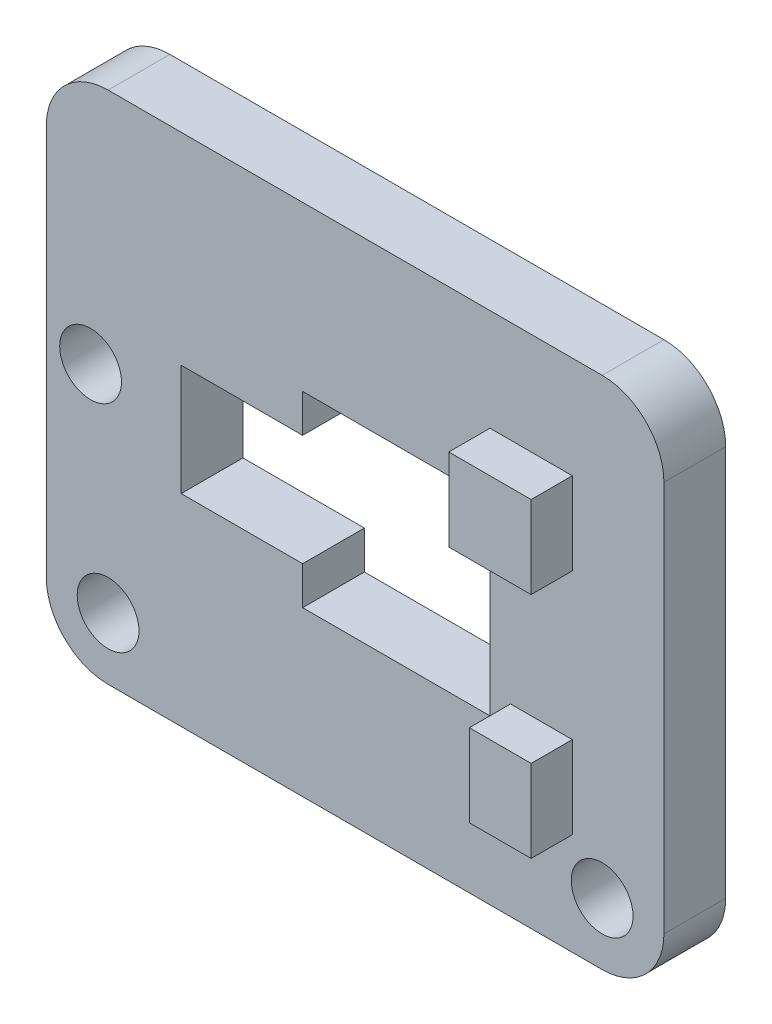
ISO-10303-21;
HEADER;
FILE_DESCRIPTION(('STEP AP214'),'2;1');
FILE_NAME('part.step','',(''),(''),'','','');
FILE_SCHEMA(('AUTOMOTIVE_DESIGN { 1 0 10303 214 1 1 1 1 }'));
ENDSEC;
DATA;
#1=APPLICATION_CONTEXT('core data for automotive mechanical design processes');
#2=APPLICATION_PROTOCOL_DEFINITION('international standard','automotive_design',2000,#1);
#3=PRODUCT_CONTEXT('',#1,'mechanical');
#4=PRODUCT('Part','Part','',(#3));
#5=PRODUCT_RELATED_PRODUCT_CATEGORY('part','',(#4));
#6=PRODUCT_DEFINITION_FORMATION('','',#4);
#7=PRODUCT_DEFINITION_CONTEXT('part definition',#1,'design');
#8=PRODUCT_DEFINITION('design','',#6,#7);
#9=PRODUCT_DEFINITION_SHAPE('','',#8);
#10=(LENGTH_UNIT() NAMED_UNIT(*) SI_UNIT(.MILLI.,.METRE.));
#11=(NAMED_UNIT(*) PLANE_ANGLE_UNIT() SI_UNIT($,.RADIAN.));
#12=(NAMED_UNIT(*) SI_UNIT($,.STERADIAN.) SOLID_ANGLE_UNIT());
#13=UNCERTAINTY_MEASURE_WITH_UNIT(LENGTH_MEASURE(1.E-05),#10,'distance_accuracy_value','');
#14=(GEOMETRIC_REPRESENTATION_CONTEXT(3) GLOBAL_UNCERTAINTY_ASSIGNED_CONTEXT((#13)) GLOBAL_UNIT_ASSIGNED_CONTEXT((#10,
#11,#12)) REPRESENTATION_CONTEXT('',''));
#15=CARTESIAN_POINT('',(0.,0.,0.));
#16=DIRECTION('',(0.,0.,1.));
#17=DIRECTION('',(1.,0.,0.));
#18=AXIS2_PLACEMENT_3D('',#15,#16,#17);
#19=CARTESIAN_POINT('',(0.,0.,3.));
#20=DIRECTION('',(0.,0.,1.));
#21=DIRECTION('',(1.,0.,0.));
#22=AXIS2_PLACEMENT_3D('',#19,#20,#21);
#23=PLANE('',#22);
#24=CARTESIAN_POINT('',(-12.85,0.55000000000001,3.));
#25=DIRECTION('',(0.,0.,1.));
#26=DIRECTION('',(1.,0.,0.));
#27=AXIS2_PLACEMENT_3D('',#24,#25,#26);
#28=CIRCLE('',#27,1.5);
#29=CARTESIAN_POINT('',(-11.35,0.55000000000001,3.));
#30=VERTEX_POINT('',#29);
#31=EDGE_CURVE('E597',#30,#30,#28,.T.);
#32=ORIENTED_EDGE('',*,*,#31,.F.);
#33=EDGE_LOOP('',(#32));
#34=FACE_BOUND('',#33,.T.);
#35=CARTESIAN_POINT('',(12.,-9.5,3.));
#36=DIRECTION('',(0.,0.,1.));
#37=DIRECTION('',(1.,0.,0.));
#38=AXIS2_PLACEMENT_3D('',#35,#36,#37);
#39=CIRCLE('',#38,1.5);
#40=CARTESIAN_POINT('',(13.5,-9.5,3.));
#41=VERTEX_POINT('',#40);
#42=EDGE_CURVE('E590',#41,#41,#39,.F.);
#43=ORIENTED_EDGE('',*,*,#42,.T.);
#44=EDGE_LOOP('',(#43));
#45=FACE_BOUND('',#44,.T.);
#46=DIRECTION('',(-1.,0.,0.));
#47=VECTOR('',#46,1.);
#48=CARTESIAN_POINT('',(15.,12.5,3.));
#49=LINE('',#48,#47);
#50=CARTESIAN_POINT('',(12.,12.5,3.));
#51=VERTEX_POINT('',#50);
#52=CARTESIAN_POINT('',(-12.,12.5,3.));
#53=VERTEX_POINT('',#52);
#54=EDGE_CURVE('E343',#51,#53,#49,.T.);
#55=ORIENTED_EDGE('',*,*,#54,.T.);
#56=CARTESIAN_POINT('',(-12.,9.5,3.));
#57=DIRECTION('',(0.,0.,1.));
#58=DIRECTION('',(1.,0.,0.));
#59=AXIS2_PLACEMENT_3D('',#56,#57,#58);
#60=CIRCLE('',#59,3.);
#61=CARTESIAN_POINT('',(-15.,9.5,3.));
#62=VERTEX_POINT('',#61);
#63=EDGE_CURVE('E378',#53,#62,#60,.T.);
#64=ORIENTED_EDGE('',*,*,#63,.T.);
#65=DIRECTION('',(0.,-1.,0.));
#66=VECTOR('',#65,1.);
#67=CARTESIAN_POINT('',(-15.,-12.5,3.));
#68=LINE('',#67,#66);
#69=CARTESIAN_POINT('',(-15.,-9.5,3.));
#70=VERTEX_POINT('',#69);
#71=EDGE_CURVE('E335',#62,#70,#68,.T.);
#72=ORIENTED_EDGE('',*,*,#71,.T.);
#73=CARTESIAN_POINT('',(-12.,-9.5,3.));
#74=DIRECTION('',(0.,0.,1.));
#75=DIRECTION('',(1.,0.,0.));
#76=AXIS2_PLACEMENT_3D('',#73,#74,#75);
#77=CIRCLE('',#76,3.);
#78=CARTESIAN_POINT('',(-12.,-12.5,3.));
#79=VERTEX_POINT('',#78);
#80=EDGE_CURVE('E373',#70,#79,#77,.T.);
#81=ORIENTED_EDGE('',*,*,#80,.T.);
#82=DIRECTION('',(1.,0.,0.));
#83=VECTOR('',#82,1.);
#84=CARTESIAN_POINT('',(15.,-12.5,3.));
#85=LINE('',#84,#83);
#86=CARTESIAN_POINT('',(12.,-12.5,3.));
#87=VERTEX_POINT('',#86);
#88=EDGE_CURVE('E338',#79,#87,#85,.T.);
#89=ORIENTED_EDGE('',*,*,#88,.T.);
#90=CARTESIAN_POINT('',(12.,-9.5,3.));
#91=DIRECTION('',(0.,0.,1.));
#92=DIRECTION('',(1.,0.,0.));
#93=AXIS2_PLACEMENT_3D('',#90,#91,#92);
#94=CIRCLE('',#93,3.);
#95=CARTESIAN_POINT('',(15.,-9.5,3.));
#96=VERTEX_POINT('',#95);
#97=EDGE_CURVE('E63',#87,#96,#94,.T.);
#98=ORIENTED_EDGE('',*,*,#97,.T.);
#99=DIRECTION('',(0.,1.,0.));
#100=VECTOR('',#99,1.);
#101=CARTESIAN_POINT('',(15.,-12.5,3.));
#102=LINE('',#101,#100);
#103=CARTESIAN_POINT('',(15.,9.5,3.));
#104=VERTEX_POINT('',#103);
#105=EDGE_CURVE('E341',#96,#104,#102,.T.);
#106=ORIENTED_EDGE('',*,*,#105,.T.);
#107=CARTESIAN_POINT('',(12.,9.5,3.));
#108=DIRECTION('',(0.,0.,1.));
#109=DIRECTION('',(1.,0.,0.));
#110=AXIS2_PLACEMENT_3D('',#107,#108,#109);
#111=CIRCLE('',#110,3.);
#112=EDGE_CURVE('E376',#104,#51,#111,.T.);
#113=ORIENTED_EDGE('',*,*,#112,.T.);
#114=EDGE_LOOP('',(#55,#64,#72,#81,#89,#98,#106,#113));
#115=FACE_BOUND('',#114,.T.);
#116=DIRECTION('',(-1.,0.,0.));
#117=VECTOR('',#116,1.);
#118=CARTESIAN_POINT('',(10.55,-3.55,3.));
#119=LINE('',#118,#117);
#120=CARTESIAN_POINT('',(10.55,-3.55,3.));
#121=VERTEX_POINT('',#120);
#122=CARTESIAN_POINT('',(7.55,-3.55,3.));
#123=VERTEX_POINT('',#122);
#124=EDGE_CURVE('E234',#121,#123,#119,.T.);
#125=ORIENTED_EDGE('',*,*,#124,.F.);
#126=DIRECTION('',(0.,1.,0.));
#127=VECTOR('',#126,1.);
#128=CARTESIAN_POINT('',(10.55,-7.54999999999999,3.));
#129=LINE('',#128,#127);
#130=CARTESIAN_POINT('',(10.55,-7.54999999999999,3.));
#131=VERTEX_POINT('',#130);
#132=EDGE_CURVE('E231',#131,#121,#129,.T.);
#133=ORIENTED_EDGE('',*,*,#132,.F.);
#134=DIRECTION('',(1.,0.,0.));
#135=VECTOR('',#134,1.);
#136=CARTESIAN_POINT('',(10.55,-7.54999999999999,3.));
#137=LINE('',#136,#135);
#138=CARTESIAN_POINT('',(7.55,-7.55,3.));
#139=VERTEX_POINT('',#138);
#140=EDGE_CURVE('E249',#139,#131,#137,.T.);
#141=ORIENTED_EDGE('',*,*,#140,.F.);
#142=DIRECTION('',(0.,-1.,0.));
#143=VECTOR('',#142,1.);
#144=CARTESIAN_POINT('',(7.55,-7.55,3.));
#145=LINE('',#144,#143);
#146=EDGE_CURVE('E257',#123,#139,#145,.T.);
#147=ORIENTED_EDGE('',*,*,#146,.F.);
#148=EDGE_LOOP('',(#125,#133,#141,#147));
#149=FACE_BOUND('',#148,.T.);
#150=DIRECTION('',(-1.,0.,0.));
#151=VECTOR('',#150,1.);
#152=CARTESIAN_POINT('',(6.55,4.55,3.));
#153=LINE('',#152,#151);
#154=CARTESIAN_POINT('',(6.55,4.55,3.));
#155=VERTEX_POINT('',#154);
#156=CARTESIAN_POINT('',(-2.55,4.55,3.));
#157=VERTEX_POINT('',#156);
#158=EDGE_CURVE('E298',#155,#157,#153,.T.);
#159=ORIENTED_EDGE('',*,*,#158,.F.);
#160=DIRECTION('',(0.,-1.,0.));
#161=VECTOR('',#160,1.);
#162=CARTESIAN_POINT('',(6.55,7.55,3.));
#163=LINE('',#162,#161);
#164=CARTESIAN_POINT('',(6.55,7.55,3.));
#165=VERTEX_POINT('',#164);
#166=EDGE_CURVE('E215',#165,#155,#163,.T.);
#167=ORIENTED_EDGE('',*,*,#166,.F.);
#168=DIRECTION('',(-1.,0.,0.));
#169=VECTOR('',#168,1.);
#170=CARTESIAN_POINT('',(10.55,7.55,3.));
#171=LINE('',#170,#169);
#172=CARTESIAN_POINT('',(10.55,7.55,3.));
#173=VERTEX_POINT('',#172);
#174=EDGE_CURVE('E230',#173,#165,#171,.T.);
#175=ORIENTED_EDGE('',*,*,#174,.F.);
#176=DIRECTION('',(0.,1.,0.));
#177=VECTOR('',#176,1.);
#178=CARTESIAN_POINT('',(10.55,7.55,3.));
#179=LINE('',#178,#177);
#180=CARTESIAN_POINT('',(10.55,3.55,3.));
#181=VERTEX_POINT('',#180);
#182=EDGE_CURVE('E222',#181,#173,#179,.T.);
#183=ORIENTED_EDGE('',*,*,#182,.F.);
#184=DIRECTION('',(1.,0.,0.));
#185=VECTOR('',#184,1.);
#186=CARTESIAN_POINT('',(10.55,3.55,3.));
#187=LINE('',#186,#185);
#188=CARTESIAN_POINT('',(6.55,3.55,3.));
#189=VERTEX_POINT('',#188);
#190=EDGE_CURVE('E203',#189,#181,#187,.T.);
#191=ORIENTED_EDGE('',*,*,#190,.F.);
#192=DIRECTION('',(0.,1.,0.));
#193=VECTOR('',#192,1.);
#194=CARTESIAN_POINT('',(6.55,0.,3.));
#195=LINE('',#194,#193);
#196=CARTESIAN_POINT('',(6.55,-4.55,3.));
#197=VERTEX_POINT('',#196);
#198=EDGE_CURVE('E270',#197,#189,#195,.T.);
#199=ORIENTED_EDGE('',*,*,#198,.F.);
#200=DIRECTION('',(1.,0.,0.));
#201=VECTOR('',#200,1.);
#202=CARTESIAN_POINT('',(-2.55,-4.55,3.));
#203=LINE('',#202,#201);
#204=CARTESIAN_POINT('',(-2.55,-4.55,3.));
#205=VERTEX_POINT('',#204);
#206=EDGE_CURVE('E275',#205,#197,#203,.T.);
#207=ORIENTED_EDGE('',*,*,#206,.F.);
#208=DIRECTION('',(0.,-1.,0.));
#209=VECTOR('',#208,1.);
#210=CARTESIAN_POINT('',(-2.55,-2.7,3.));
#211=LINE('',#210,#209);
#212=CARTESIAN_POINT('',(-2.55,-2.7,3.));
#213=VERTEX_POINT('',#212);
#214=EDGE_CURVE('E313',#213,#205,#211,.T.);
#215=ORIENTED_EDGE('',*,*,#214,.F.);
#216=DIRECTION('',(1.,0.,0.));
#217=VECTOR('',#216,1.);
#218=CARTESIAN_POINT('',(-8.45,-2.7,3.));
#219=LINE('',#218,#217);
#220=CARTESIAN_POINT('',(-8.45,-2.7,3.));
#221=VERTEX_POINT('',#220);
#222=EDGE_CURVE('E310',#221,#213,#219,.T.);
#223=ORIENTED_EDGE('',*,*,#222,.F.);
#224=DIRECTION('',(0.,-1.,0.));
#225=VECTOR('',#224,1.);
#226=CARTESIAN_POINT('',(-8.45,0.,3.));
#227=LINE('',#226,#225);
#228=CARTESIAN_POINT('',(-8.45,2.7,3.));
#229=VERTEX_POINT('',#228);
#230=EDGE_CURVE('E307',#229,#221,#227,.T.);
#231=ORIENTED_EDGE('',*,*,#230,.F.);
#232=DIRECTION('',(-1.,0.,0.));
#233=VECTOR('',#232,1.);
#234=CARTESIAN_POINT('',(-2.55,2.7,3.));
#235=LINE('',#234,#233);
#236=CARTESIAN_POINT('',(-2.55,2.7,3.));
#237=VERTEX_POINT('',#236);
#238=EDGE_CURVE('E304',#237,#229,#235,.T.);
#239=ORIENTED_EDGE('',*,*,#238,.F.);
#240=DIRECTION('',(0.,-1.,0.));
#241=VECTOR('',#240,1.);
#242=CARTESIAN_POINT('',(-2.55,4.55,3.));
#243=LINE('',#242,#241);
#244=EDGE_CURVE('E301',#157,#237,#243,.T.);
#245=ORIENTED_EDGE('',*,*,#244,.F.);
#246=EDGE_LOOP('',(#159,#167,#175,#183,#191,#199,#207,#215,#223,#231,#239,#245));
#247=FACE_BOUND('',#246,.T.);
#248=CARTESIAN_POINT('',(-12.,-9.5,3.));
#249=DIRECTION('',(0.,0.,1.));
#250=DIRECTION('',(1.,0.,0.));
#251=AXIS2_PLACEMENT_3D('',#248,#249,#250);
#252=CIRCLE('',#251,1.5);
#253=CARTESIAN_POINT('',(-10.5,-9.5,3.));
#254=VERTEX_POINT('',#253);
#255=EDGE_CURVE('E587',#254,#254,#252,.T.);
#256=ORIENTED_EDGE('',*,*,#255,.F.);
#257=EDGE_LOOP('',(#256));
#258=FACE_BOUND('',#257,.T.);
#259=ADVANCED_FACE('F41',(#34,#45,#115,#149,#247,#258),#23,.T.);
#260=CARTESIAN_POINT('',(0.,0.,0.));
#261=DIRECTION('',(0.,0.,1.));
#262=DIRECTION('',(1.,0.,0.));
#263=AXIS2_PLACEMENT_3D('',#260,#261,#262);
#264=PLANE('',#263);
#265=CARTESIAN_POINT('',(-12.85,0.55000000000001,0.));
#266=DIRECTION('',(0.,0.,-1.));
#267=DIRECTION('',(-1.,0.,0.));
#268=AXIS2_PLACEMENT_3D('',#265,#266,#267);
#269=CIRCLE('',#268,1.5);
#270=CARTESIAN_POINT('',(-14.35,0.55000000000001,0.));
#271=VERTEX_POINT('',#270);
#272=EDGE_CURVE('E601',#271,#271,#269,.T.);
#273=ORIENTED_EDGE('',*,*,#272,.F.);
#274=EDGE_LOOP('',(#273));
#275=FACE_BOUND('',#274,.T.);
#276=DIRECTION('',(0.,-1.,0.));
#277=VECTOR('',#276,1.);
#278=CARTESIAN_POINT('',(-15.,-12.5,0.));
#279=LINE('',#278,#277);
#280=CARTESIAN_POINT('',(-15.,9.5,0.));
#281=VERTEX_POINT('',#280);
#282=CARTESIAN_POINT('',(-15.,-9.5,0.));
#283=VERTEX_POINT('',#282);
#284=EDGE_CURVE('E320',#281,#283,#279,.T.);
#285=ORIENTED_EDGE('',*,*,#284,.F.);
#286=CARTESIAN_POINT('',(-12.,9.5,0.));
#287=DIRECTION('',(0.,0.,1.));
#288=DIRECTION('',(1.,0.,0.));
#289=AXIS2_PLACEMENT_3D('',#286,#287,#288);
#290=CIRCLE('',#289,3.);
#291=CARTESIAN_POINT('',(-12.,12.5,0.));
#292=VERTEX_POINT('',#291);
#293=EDGE_CURVE('E366',#281,#292,#290,.F.);
#294=ORIENTED_EDGE('',*,*,#293,.T.);
#295=DIRECTION('',(-1.,0.,0.));
#296=VECTOR('',#295,1.);
#297=CARTESIAN_POINT('',(15.,12.5,0.));
#298=LINE('',#297,#296);
#299=CARTESIAN_POINT('',(12.,12.5,0.));
#300=VERTEX_POINT('',#299);
#301=EDGE_CURVE('E339',#300,#292,#298,.T.);
#302=ORIENTED_EDGE('',*,*,#301,.F.);
#303=CARTESIAN_POINT('',(12.,9.5,0.));
#304=DIRECTION('',(0.,0.,1.));
#305=DIRECTION('',(1.,0.,0.));
#306=AXIS2_PLACEMENT_3D('',#303,#304,#305);
#307=CIRCLE('',#306,3.);
#308=CARTESIAN_POINT('',(15.,9.5,0.));
#309=VERTEX_POINT('',#308);
#310=EDGE_CURVE('E364',#300,#309,#307,.F.);
#311=ORIENTED_EDGE('',*,*,#310,.T.);
#312=DIRECTION('',(0.,1.,0.));
#313=VECTOR('',#312,1.);
#314=CARTESIAN_POINT('',(15.,-12.5,0.));
#315=LINE('',#314,#313);
#316=CARTESIAN_POINT('',(15.,-9.5,0.));
#317=VERTEX_POINT('',#316);
#318=EDGE_CURVE('E352',#317,#309,#315,.T.);
#319=ORIENTED_EDGE('',*,*,#318,.F.);
#320=CARTESIAN_POINT('',(12.,-9.5,0.));
#321=DIRECTION('',(0.,0.,1.));
#322=DIRECTION('',(1.,0.,0.));
#323=AXIS2_PLACEMENT_3D('',#320,#321,#322);
#324=CIRCLE('',#323,3.);
#325=CARTESIAN_POINT('',(12.,-12.5,0.));
#326=VERTEX_POINT('',#325);
#327=EDGE_CURVE('E362',#317,#326,#324,.F.);
#328=ORIENTED_EDGE('',*,*,#327,.T.);
#329=DIRECTION('',(1.,0.,0.));
#330=VECTOR('',#329,1.);
#331=CARTESIAN_POINT('',(15.,-12.5,0.));
#332=LINE('',#331,#330);
#333=CARTESIAN_POINT('',(-12.,-12.5,0.));
#334=VERTEX_POINT('',#333);
#335=EDGE_CURVE('E349',#334,#326,#332,.T.);
#336=ORIENTED_EDGE('',*,*,#335,.F.);
#337=CARTESIAN_POINT('',(-12.,-9.5,0.));
#338=DIRECTION('',(0.,0.,1.));
#339=DIRECTION('',(1.,0.,0.));
#340=AXIS2_PLACEMENT_3D('',#337,#338,#339);
#341=CIRCLE('',#340,3.);
#342=EDGE_CURVE('E360',#334,#283,#341,.F.);
#343=ORIENTED_EDGE('',*,*,#342,.T.);
#344=EDGE_LOOP('',(#285,#294,#302,#311,#319,#328,#336,#343));
#345=FACE_BOUND('',#344,.T.);
#346=DIRECTION('',(0.,-1.,0.));
#347=VECTOR('',#346,1.);
#348=CARTESIAN_POINT('',(-2.55,-2.7,0.));
#349=LINE('',#348,#347);
#350=CARTESIAN_POINT('',(-2.55,-2.7,0.));
#351=VERTEX_POINT('',#350);
#352=CARTESIAN_POINT('',(-2.55,-4.55,0.));
#353=VERTEX_POINT('',#352);
#354=EDGE_CURVE('E290',#351,#353,#349,.T.);
#355=ORIENTED_EDGE('',*,*,#354,.T.);
#356=DIRECTION('',(1.,0.,0.));
#357=VECTOR('',#356,1.);
#358=CARTESIAN_POINT('',(-2.55,-4.55,0.));
#359=LINE('',#358,#357);
#360=CARTESIAN_POINT('',(6.55,-4.55,0.));
#361=VERTEX_POINT('',#360);
#362=EDGE_CURVE('E293',#353,#361,#359,.T.);
#363=ORIENTED_EDGE('',*,*,#362,.T.);
#364=DIRECTION('',(0.,1.,0.));
#365=VECTOR('',#364,1.);
#366=CARTESIAN_POINT('',(6.55,-4.55,0.));
#367=LINE('',#366,#365);
#368=CARTESIAN_POINT('',(6.55,4.55,0.));
#369=VERTEX_POINT('',#368);
#370=EDGE_CURVE('E271',#361,#369,#367,.T.);
#371=ORIENTED_EDGE('',*,*,#370,.T.);
#372=DIRECTION('',(-1.,0.,0.));
#373=VECTOR('',#372,1.);
#374=CARTESIAN_POINT('',(6.55,4.55,0.));
#375=LINE('',#374,#373);
#376=CARTESIAN_POINT('',(-2.55,4.55,0.));
#377=VERTEX_POINT('',#376);
#378=EDGE_CURVE('E274',#369,#377,#375,.T.);
#379=ORIENTED_EDGE('',*,*,#378,.T.);
#380=DIRECTION('',(0.,-1.,0.));
#381=VECTOR('',#380,1.);
#382=CARTESIAN_POINT('',(-2.55,4.55,0.));
#383=LINE('',#382,#381);
#384=CARTESIAN_POINT('',(-2.55,2.7,0.));
#385=VERTEX_POINT('',#384);
#386=EDGE_CURVE('E278',#377,#385,#383,.T.);
#387=ORIENTED_EDGE('',*,*,#386,.T.);
#388=DIRECTION('',(-1.,0.,0.));
#389=VECTOR('',#388,1.);
#390=CARTESIAN_POINT('',(-2.55,2.7,0.));
#391=LINE('',#390,#389);
#392=CARTESIAN_POINT('',(-8.45,2.7,0.));
#393=VERTEX_POINT('',#392);
#394=EDGE_CURVE('E281',#385,#393,#391,.T.);
#395=ORIENTED_EDGE('',*,*,#394,.T.);
#396=DIRECTION('',(0.,-1.,0.));
#397=VECTOR('',#396,1.);
#398=CARTESIAN_POINT('',(-8.45,2.7,0.));
#399=LINE('',#398,#397);
#400=CARTESIAN_POINT('',(-8.45,-2.7,0.));
#401=VERTEX_POINT('',#400);
#402=EDGE_CURVE('E284',#393,#401,#399,.T.);
#403=ORIENTED_EDGE('',*,*,#402,.T.);
#404=DIRECTION('',(1.,0.,0.));
#405=VECTOR('',#404,1.);
#406=CARTESIAN_POINT('',(-8.45,-2.7,0.));
#407=LINE('',#406,#405);
#408=EDGE_CURVE('E287',#401,#351,#407,.T.);
#409=ORIENTED_EDGE('',*,*,#408,.T.);
#410=EDGE_LOOP('',(#355,#363,#371,#379,#387,#395,#403,#409));
#411=FACE_BOUND('',#410,.T.);
#412=CARTESIAN_POINT('',(12.,-9.5,0.));
#413=DIRECTION('',(0.,0.,-1.));
#414=DIRECTION('',(-1.,0.,0.));
#415=AXIS2_PLACEMENT_3D('',#412,#413,#414);
#416=CIRCLE('',#415,1.5);
#417=CARTESIAN_POINT('',(10.5,-9.5,0.));
#418=VERTEX_POINT('',#417);
#419=EDGE_CURVE('E594',#418,#418,#416,.F.);
#420=ORIENTED_EDGE('',*,*,#419,.T.);
#421=EDGE_LOOP('',(#420));
#422=FACE_BOUND('',#421,.T.);
#423=CARTESIAN_POINT('',(-12.,-9.5,0.));
#424=DIRECTION('',(0.,0.,-1.));
#425=DIRECTION('',(-1.,0.,0.));
#426=AXIS2_PLACEMENT_3D('',#423,#424,#425);
#427=CIRCLE('',#426,1.5);
#428=CARTESIAN_POINT('',(-13.5,-9.5,0.));
#429=VERTEX_POINT('',#428);
#430=EDGE_CURVE('E593',#429,#429,#427,.T.);
#431=ORIENTED_EDGE('',*,*,#430,.F.);
#432=EDGE_LOOP('',(#431));
#433=FACE_BOUND('',#432,.T.);
#434=ADVANCED_FACE('F394',(#275,#345,#411,#422,#433),#264,.F.);
#435=CARTESIAN_POINT('',(-15.,-12.5,3.));
#436=DIRECTION('',(1.,0.,0.));
#437=DIRECTION('',(0.,0.,-1.));
#438=AXIS2_PLACEMENT_3D('',#435,#436,#437);
#439=PLANE('',#438);
#440=ORIENTED_EDGE('',*,*,#71,.F.);
#441=DIRECTION('',(0.,0.,-1.));
#442=VECTOR('',#441,1.);
#443=CARTESIAN_POINT('',(-15.,9.5,3.));
#444=LINE('',#443,#442);
#445=EDGE_CURVE('E357',#62,#281,#444,.T.);
#446=ORIENTED_EDGE('',*,*,#445,.T.);
#447=ORIENTED_EDGE('',*,*,#284,.T.);
#448=DIRECTION('',(0.,0.,-1.));
#449=VECTOR('',#448,1.);
#450=CARTESIAN_POINT('',(-15.,-9.5,3.));
#451=LINE('',#450,#449);
#452=EDGE_CURVE('E346',#283,#70,#451,.F.);
#453=ORIENTED_EDGE('',*,*,#452,.T.);
#454=EDGE_LOOP('',(#440,#446,#447,#453));
#455=FACE_BOUND('',#454,.T.);
#456=ADVANCED_FACE('F417',(#455),#439,.F.);
#457=CARTESIAN_POINT('',(15.,-12.5,3.));
#458=DIRECTION('',(0.,1.,0.));
#459=DIRECTION('',(-1.,0.,0.));
#460=AXIS2_PLACEMENT_3D('',#457,#458,#459);
#461=PLANE('',#460);
#462=ORIENTED_EDGE('',*,*,#335,.T.);
#463=DIRECTION('',(0.,0.,-1.));
#464=VECTOR('',#463,1.);
#465=CARTESIAN_POINT('',(12.,-12.5,3.));
#466=LINE('',#465,#464);
#467=EDGE_CURVE('E11',#326,#87,#466,.F.);
#468=ORIENTED_EDGE('',*,*,#467,.T.);
#469=ORIENTED_EDGE('',*,*,#88,.F.);
#470=DIRECTION('',(0.,0.,-1.));
#471=VECTOR('',#470,1.);
#472=CARTESIAN_POINT('',(-12.,-12.5,3.));
#473=LINE('',#472,#471);
#474=EDGE_CURVE('E49',#79,#334,#473,.T.);
#475=ORIENTED_EDGE('',*,*,#474,.T.);
#476=EDGE_LOOP('',(#462,#468,#469,#475));
#477=FACE_BOUND('',#476,.T.);
#478=ADVANCED_FACE('F388',(#477),#461,.F.);
#479=CARTESIAN_POINT('',(15.,-12.5,3.));
#480=DIRECTION('',(-1.,0.,0.));
#481=DIRECTION('',(0.,0.,1.));
#482=AXIS2_PLACEMENT_3D('',#479,#480,#481);
#483=PLANE('',#482);
#484=ORIENTED_EDGE('',*,*,#318,.T.);
#485=DIRECTION('',(0.,0.,-1.));
#486=VECTOR('',#485,1.);
#487=CARTESIAN_POINT('',(15.,9.5,3.));
#488=LINE('',#487,#486);
#489=EDGE_CURVE('E56',#309,#104,#488,.F.);
#490=ORIENTED_EDGE('',*,*,#489,.T.);
#491=ORIENTED_EDGE('',*,*,#105,.F.);
#492=DIRECTION('',(0.,0.,-1.));
#493=VECTOR('',#492,1.);
#494=CARTESIAN_POINT('',(15.,-9.5,3.));
#495=LINE('',#494,#493);
#496=EDGE_CURVE('E380',#96,#317,#495,.T.);
#497=ORIENTED_EDGE('',*,*,#496,.T.);
#498=EDGE_LOOP('',(#484,#490,#491,#497));
#499=FACE_BOUND('',#498,.T.);
#500=ADVANCED_FACE('F400',(#499),#483,.F.);
#501=CARTESIAN_POINT('',(15.,12.5,3.));
#502=DIRECTION('',(0.,-1.,0.));
#503=DIRECTION('',(1.,0.,0.));
#504=AXIS2_PLACEMENT_3D('',#501,#502,#503);
#505=PLANE('',#504);
#506=ORIENTED_EDGE('',*,*,#301,.T.);
#507=DIRECTION('',(0.,0.,-1.));
#508=VECTOR('',#507,1.);
#509=CARTESIAN_POINT('',(-12.,12.5,3.));
#510=LINE('',#509,#508);
#511=EDGE_CURVE('E371',#292,#53,#510,.F.);
#512=ORIENTED_EDGE('',*,*,#511,.T.);
#513=ORIENTED_EDGE('',*,*,#54,.F.);
#514=DIRECTION('',(0.,0.,-1.));
#515=VECTOR('',#514,1.);
#516=CARTESIAN_POINT('',(12.,12.5,3.));
#517=LINE('',#516,#515);
#518=EDGE_CURVE('E368',#51,#300,#517,.T.);
#519=ORIENTED_EDGE('',*,*,#518,.T.);
#520=EDGE_LOOP('',(#506,#512,#513,#519));
#521=FACE_BOUND('',#520,.T.);
#522=ADVANCED_FACE('F409',(#521),#505,.F.);
#523=CARTESIAN_POINT('',(-2.55,-4.55,0.));
#524=DIRECTION('',(0.,-1.,0.));
#525=DIRECTION('',(0.,0.,-1.));
#526=AXIS2_PLACEMENT_3D('',#523,#524,#525);
#527=PLANE('',#526);
#528=ORIENTED_EDGE('',*,*,#206,.T.);
#529=DIRECTION('',(0.,0.,1.));
#530=VECTOR('',#529,1.);
#531=CARTESIAN_POINT('',(6.55,-4.55,0.));
#532=LINE('',#531,#530);
#533=EDGE_CURVE('E317',#361,#197,#532,.T.);
#534=ORIENTED_EDGE('',*,*,#533,.F.);
#535=ORIENTED_EDGE('',*,*,#362,.F.);
#536=DIRECTION('',(0.,0.,1.));
#537=VECTOR('',#536,1.);
#538=CARTESIAN_POINT('',(-2.55,-4.55,0.));
#539=LINE('',#538,#537);
#540=EDGE_CURVE('E321',#353,#205,#539,.T.);
#541=ORIENTED_EDGE('',*,*,#540,.T.);
#542=EDGE_LOOP('',(#528,#534,#535,#541));
#543=FACE_BOUND('',#542,.T.);
#544=ADVANCED_FACE('F445',(#543),#527,.F.);
#545=CARTESIAN_POINT('',(-2.55,-2.7,0.));
#546=DIRECTION('',(-1.,0.,0.));
#547=DIRECTION('',(0.,-1.,0.));
#548=AXIS2_PLACEMENT_3D('',#545,#546,#547);
#549=PLANE('',#548);
#550=ORIENTED_EDGE('',*,*,#214,.T.);
#551=ORIENTED_EDGE('',*,*,#540,.F.);
#552=ORIENTED_EDGE('',*,*,#354,.F.);
#553=DIRECTION('',(0.,0.,1.));
#554=VECTOR('',#553,1.);
#555=CARTESIAN_POINT('',(-2.55,-2.7,0.));
#556=LINE('',#555,#554);
#557=EDGE_CURVE('E323',#351,#213,#556,.T.);
#558=ORIENTED_EDGE('',*,*,#557,.T.);
#559=EDGE_LOOP('',(#550,#551,#552,#558));
#560=FACE_BOUND('',#559,.T.);
#561=ADVANCED_FACE('F543',(#560),#549,.F.);
#562=CARTESIAN_POINT('',(-8.45,-2.7,0.));
#563=DIRECTION('',(0.,-1.,0.));
#564=DIRECTION('',(0.,0.,-1.));
#565=AXIS2_PLACEMENT_3D('',#562,#563,#564);
#566=PLANE('',#565);
#567=ORIENTED_EDGE('',*,*,#222,.T.);
#568=ORIENTED_EDGE('',*,*,#557,.F.);
#569=ORIENTED_EDGE('',*,*,#408,.F.);
#570=DIRECTION('',(0.,0.,1.));
#571=VECTOR('',#570,1.);
#572=CARTESIAN_POINT('',(-8.45,-2.7,0.));
#573=LINE('',#572,#571);
#574=EDGE_CURVE('E325',#401,#221,#573,.T.);
#575=ORIENTED_EDGE('',*,*,#574,.T.);
#576=EDGE_LOOP('',(#567,#568,#569,#575));
#577=FACE_BOUND('',#576,.T.);
#578=ADVANCED_FACE('F547',(#577),#566,.F.);
#579=CARTESIAN_POINT('',(-8.45,0.,0.));
#580=DIRECTION('',(-1.,0.,0.));
#581=DIRECTION('',(0.,0.,1.));
#582=AXIS2_PLACEMENT_3D('',#579,#580,#581);
#583=PLANE('',#582);
#584=ORIENTED_EDGE('',*,*,#230,.T.);
#585=ORIENTED_EDGE('',*,*,#574,.F.);
#586=ORIENTED_EDGE('',*,*,#402,.F.);
#587=DIRECTION('',(0.,0.,1.));
#588=VECTOR('',#587,1.);
#589=CARTESIAN_POINT('',(-8.45,2.7,0.));
#590=LINE('',#589,#588);
#591=EDGE_CURVE('E327',#393,#229,#590,.T.);
#592=ORIENTED_EDGE('',*,*,#591,.T.);
#593=EDGE_LOOP('',(#584,#585,#586,#592));
#594=FACE_BOUND('',#593,.T.);
#595=ADVANCED_FACE('F551',(#594),#583,.F.);
#596=CARTESIAN_POINT('',(-2.55,2.7,0.));
#597=DIRECTION('',(0.,1.,0.));
#598=DIRECTION('',(-1.,0.,0.));
#599=AXIS2_PLACEMENT_3D('',#596,#597,#598);
#600=PLANE('',#599);
#601=ORIENTED_EDGE('',*,*,#238,.T.);
#602=ORIENTED_EDGE('',*,*,#591,.F.);
#603=ORIENTED_EDGE('',*,*,#394,.F.);
#604=DIRECTION('',(0.,0.,1.));
#605=VECTOR('',#604,1.);
#606=CARTESIAN_POINT('',(-2.55,2.7,0.));
#607=LINE('',#606,#605);
#608=EDGE_CURVE('E329',#385,#237,#607,.T.);
#609=ORIENTED_EDGE('',*,*,#608,.T.);
#610=EDGE_LOOP('',(#601,#602,#603,#609));
#611=FACE_BOUND('',#610,.T.);
#612=ADVANCED_FACE('F555',(#611),#600,.F.);
#613=CARTESIAN_POINT('',(-2.55,4.55,0.));
#614=DIRECTION('',(-1.,0.,0.));
#615=DIRECTION('',(0.,0.,1.));
#616=AXIS2_PLACEMENT_3D('',#613,#614,#615);
#617=PLANE('',#616);
#618=ORIENTED_EDGE('',*,*,#244,.T.);
#619=ORIENTED_EDGE('',*,*,#608,.F.);
#620=ORIENTED_EDGE('',*,*,#386,.F.);
#621=DIRECTION('',(0.,0.,1.));
#622=VECTOR('',#621,1.);
#623=CARTESIAN_POINT('',(-2.55,4.55,0.));
#624=LINE('',#623,#622);
#625=EDGE_CURVE('E331',#377,#157,#624,.T.);
#626=ORIENTED_EDGE('',*,*,#625,.T.);
#627=EDGE_LOOP('',(#618,#619,#620,#626));
#628=FACE_BOUND('',#627,.T.);
#629=ADVANCED_FACE('F559',(#628),#617,.F.);
#630=CARTESIAN_POINT('',(6.55,4.55,0.));
#631=DIRECTION('',(0.,1.,0.));
#632=DIRECTION('',(-1.,0.,0.));
#633=AXIS2_PLACEMENT_3D('',#630,#631,#632);
#634=PLANE('',#633);
#635=ORIENTED_EDGE('',*,*,#158,.T.);
#636=ORIENTED_EDGE('',*,*,#625,.F.);
#637=ORIENTED_EDGE('',*,*,#378,.F.);
#638=DIRECTION('',(0.,0.,1.));
#639=VECTOR('',#638,1.);
#640=CARTESIAN_POINT('',(6.55,4.55,0.));
#641=LINE('',#640,#639);
#642=EDGE_CURVE('E296',#369,#155,#641,.T.);
#643=ORIENTED_EDGE('',*,*,#642,.T.);
#644=EDGE_LOOP('',(#635,#636,#637,#643));
#645=FACE_BOUND('',#644,.T.);
#646=ADVANCED_FACE('F562',(#645),#634,.F.);
#647=CARTESIAN_POINT('',(6.55,0.,0.));
#648=DIRECTION('',(1.,0.,0.));
#649=DIRECTION('',(0.,0.,-1.));
#650=AXIS2_PLACEMENT_3D('',#647,#648,#649);
#651=PLANE('',#650);
#652=ORIENTED_EDGE('',*,*,#198,.T.);
#653=DIRECTION('',(0.,0.,-1.));
#654=VECTOR('',#653,1.);
#655=CARTESIAN_POINT('',(6.55,3.55,5.));
#656=LINE('',#655,#654);
#657=CARTESIAN_POINT('',(6.55,3.55,5.));
#658=VERTEX_POINT('',#657);
#659=EDGE_CURVE('E210',#658,#189,#656,.T.);
#660=ORIENTED_EDGE('',*,*,#659,.F.);
#661=DIRECTION('',(0.,-1.,0.));
#662=VECTOR('',#661,1.);
#663=CARTESIAN_POINT('',(6.55,7.55,5.));
#664=LINE('',#663,#662);
#665=CARTESIAN_POINT('',(6.55,7.55,5.));
#666=VERTEX_POINT('',#665);
#667=EDGE_CURVE('E240',#666,#658,#664,.T.);
#668=ORIENTED_EDGE('',*,*,#667,.F.);
#669=DIRECTION('',(0.,0.,-1.));
#670=VECTOR('',#669,1.);
#671=CARTESIAN_POINT('',(6.55,7.55,5.));
#672=LINE('',#671,#670);
#673=EDGE_CURVE('E581',#666,#165,#672,.T.);
#674=ORIENTED_EDGE('',*,*,#673,.T.);
#675=ORIENTED_EDGE('',*,*,#166,.T.);
#676=ORIENTED_EDGE('',*,*,#642,.F.);
#677=ORIENTED_EDGE('',*,*,#370,.F.);
#678=ORIENTED_EDGE('',*,*,#533,.T.);
#679=EDGE_LOOP('',(#652,#660,#668,#674,#675,#676,#677,#678));
#680=FACE_BOUND('',#679,.T.);
#681=ADVANCED_FACE('F440',(#680),#651,.F.);
#682=CARTESIAN_POINT('',(10.55,-7.54999999999999,5.));
#683=DIRECTION('',(-1.,0.,0.));
#684=DIRECTION('',(0.,-1.,0.));
#685=AXIS2_PLACEMENT_3D('',#682,#683,#684);
#686=PLANE('',#685);
#687=ORIENTED_EDGE('',*,*,#132,.T.);
#688=DIRECTION('',(0.,0.,-1.));
#689=VECTOR('',#688,1.);
#690=CARTESIAN_POINT('',(10.55,-3.55,5.));
#691=LINE('',#690,#689);
#692=CARTESIAN_POINT('',(10.55,-3.55,5.));
#693=VERTEX_POINT('',#692);
#694=EDGE_CURVE('E268',#693,#121,#691,.T.);
#695=ORIENTED_EDGE('',*,*,#694,.F.);
#696=DIRECTION('',(0.,1.,0.));
#697=VECTOR('',#696,1.);
#698=CARTESIAN_POINT('',(10.55,-7.54999999999999,5.));
#699=LINE('',#698,#697);
#700=CARTESIAN_POINT('',(10.55,-7.54999999999999,5.));
#701=VERTEX_POINT('',#700);
#702=EDGE_CURVE('E245',#701,#693,#699,.T.);
#703=ORIENTED_EDGE('',*,*,#702,.F.);
#704=DIRECTION('',(0.,0.,-1.));
#705=VECTOR('',#704,1.);
#706=CARTESIAN_POINT('',(10.55,-7.54999999999999,5.));
#707=LINE('',#706,#705);
#708=EDGE_CURVE('E254',#701,#131,#707,.T.);
#709=ORIENTED_EDGE('',*,*,#708,.T.);
#710=EDGE_LOOP('',(#687,#695,#703,#709));
#711=FACE_BOUND('',#710,.T.);
#712=ADVANCED_FACE('F536',(#711),#686,.F.);
#713=CARTESIAN_POINT('',(10.55,-3.55,5.));
#714=DIRECTION('',(0.,-1.,0.));
#715=DIRECTION('',(1.,0.,0.));
#716=AXIS2_PLACEMENT_3D('',#713,#714,#715);
#717=PLANE('',#716);
#718=ORIENTED_EDGE('',*,*,#124,.T.);
#719=DIRECTION('',(0.,0.,-1.));
#720=VECTOR('',#719,1.);
#721=CARTESIAN_POINT('',(7.55,-3.55,5.));
#722=LINE('',#721,#720);
#723=CARTESIAN_POINT('',(7.55,-3.55,5.));
#724=VERTEX_POINT('',#723);
#725=EDGE_CURVE('E265',#724,#123,#722,.T.);
#726=ORIENTED_EDGE('',*,*,#725,.F.);
#727=DIRECTION('',(-1.,0.,0.));
#728=VECTOR('',#727,1.);
#729=CARTESIAN_POINT('',(10.55,-3.55,5.));
#730=LINE('',#729,#728);
#731=EDGE_CURVE('E248',#693,#724,#730,.T.);
#732=ORIENTED_EDGE('',*,*,#731,.F.);
#733=ORIENTED_EDGE('',*,*,#694,.T.);
#734=EDGE_LOOP('',(#718,#726,#732,#733));
#735=FACE_BOUND('',#734,.T.);
#736=ADVANCED_FACE('F532',(#735),#717,.F.);
#737=CARTESIAN_POINT('',(7.55,-7.55,5.));
#738=DIRECTION('',(1.,0.,0.));
#739=DIRECTION('',(0.,1.,0.));
#740=AXIS2_PLACEMENT_3D('',#737,#738,#739);
#741=PLANE('',#740);
#742=ORIENTED_EDGE('',*,*,#146,.T.);
#743=DIRECTION('',(0.,0.,-1.));
#744=VECTOR('',#743,1.);
#745=CARTESIAN_POINT('',(7.55,-7.55,5.));
#746=LINE('',#745,#744);
#747=CARTESIAN_POINT('',(7.55,-7.55,5.));
#748=VERTEX_POINT('',#747);
#749=EDGE_CURVE('E263',#748,#139,#746,.T.);
#750=ORIENTED_EDGE('',*,*,#749,.F.);
#751=DIRECTION('',(0.,-1.,0.));
#752=VECTOR('',#751,1.);
#753=CARTESIAN_POINT('',(7.55,-7.55,5.));
#754=LINE('',#753,#752);
#755=EDGE_CURVE('E251',#724,#748,#754,.T.);
#756=ORIENTED_EDGE('',*,*,#755,.F.);
#757=ORIENTED_EDGE('',*,*,#725,.T.);
#758=EDGE_LOOP('',(#742,#750,#756,#757));
#759=FACE_BOUND('',#758,.T.);
#760=ADVANCED_FACE('F528',(#759),#741,.F.);
#761=CARTESIAN_POINT('',(10.55,-7.54999999999999,5.));
#762=DIRECTION('',(0.,1.,0.));
#763=DIRECTION('',(-1.,0.,0.));
#764=AXIS2_PLACEMENT_3D('',#761,#762,#763);
#765=PLANE('',#764);
#766=ORIENTED_EDGE('',*,*,#140,.T.);
#767=ORIENTED_EDGE('',*,*,#708,.F.);
#768=DIRECTION('',(1.,0.,0.));
#769=VECTOR('',#768,1.);
#770=CARTESIAN_POINT('',(10.55,-7.54999999999999,5.));
#771=LINE('',#770,#769);
#772=EDGE_CURVE('E253',#748,#701,#771,.T.);
#773=ORIENTED_EDGE('',*,*,#772,.F.);
#774=ORIENTED_EDGE('',*,*,#749,.T.);
#775=EDGE_LOOP('',(#766,#767,#773,#774));
#776=FACE_BOUND('',#775,.T.);
#777=ADVANCED_FACE('F524',(#776),#765,.F.);
#778=CARTESIAN_POINT('',(0.,0.,5.));
#779=DIRECTION('',(0.,0.,1.));
#780=DIRECTION('',(1.,0.,0.));
#781=AXIS2_PLACEMENT_3D('',#778,#779,#780);
#782=PLANE('',#781);
#783=ORIENTED_EDGE('',*,*,#702,.T.);
#784=ORIENTED_EDGE('',*,*,#731,.T.);
#785=ORIENTED_EDGE('',*,*,#755,.T.);
#786=ORIENTED_EDGE('',*,*,#772,.T.);
#787=EDGE_LOOP('',(#783,#784,#785,#786));
#788=FACE_BOUND('',#787,.T.);
#789=ADVANCED_FACE('F513',(#788),#782,.T.);
#790=CARTESIAN_POINT('',(10.55,7.55,5.));
#791=DIRECTION('',(-1.,0.,0.));
#792=DIRECTION('',(0.,-1.,0.));
#793=AXIS2_PLACEMENT_3D('',#790,#791,#792);
#794=PLANE('',#793);
#795=ORIENTED_EDGE('',*,*,#182,.T.);
#796=DIRECTION('',(0.,0.,-1.));
#797=VECTOR('',#796,1.);
#798=CARTESIAN_POINT('',(10.55,7.55,5.));
#799=LINE('',#798,#797);
#800=CARTESIAN_POINT('',(10.55,7.55,5.));
#801=VERTEX_POINT('',#800);
#802=EDGE_CURVE('E585',#801,#173,#799,.T.);
#803=ORIENTED_EDGE('',*,*,#802,.F.);
#804=DIRECTION('',(0.,1.,0.));
#805=VECTOR('',#804,1.);
#806=CARTESIAN_POINT('',(10.55,7.55,5.));
#807=LINE('',#806,#805);
#808=CARTESIAN_POINT('',(10.55,3.55,5.));
#809=VERTEX_POINT('',#808);
#810=EDGE_CURVE('E216',#809,#801,#807,.T.);
#811=ORIENTED_EDGE('',*,*,#810,.F.);
#812=DIRECTION('',(0.,0.,-1.));
#813=VECTOR('',#812,1.);
#814=CARTESIAN_POINT('',(10.55,3.55,5.));
#815=LINE('',#814,#813);
#816=EDGE_CURVE('E207',#809,#181,#815,.T.);
#817=ORIENTED_EDGE('',*,*,#816,.T.);
#818=EDGE_LOOP('',(#795,#803,#811,#817));
#819=FACE_BOUND('',#818,.T.);
#820=ADVANCED_FACE('F220',(#819),#794,.F.);
#821=CARTESIAN_POINT('',(10.55,7.55,5.));
#822=DIRECTION('',(0.,-1.,0.));
#823=DIRECTION('',(1.,0.,0.));
#824=AXIS2_PLACEMENT_3D('',#821,#822,#823);
#825=PLANE('',#824);
#826=ORIENTED_EDGE('',*,*,#174,.T.);
#827=ORIENTED_EDGE('',*,*,#673,.F.);
#828=DIRECTION('',(-1.,0.,0.));
#829=VECTOR('',#828,1.);
#830=CARTESIAN_POINT('',(10.55,7.55,5.));
#831=LINE('',#830,#829);
#832=EDGE_CURVE('E242',#801,#666,#831,.T.);
#833=ORIENTED_EDGE('',*,*,#832,.F.);
#834=ORIENTED_EDGE('',*,*,#802,.T.);
#835=EDGE_LOOP('',(#826,#827,#833,#834));
#836=FACE_BOUND('',#835,.T.);
#837=ADVANCED_FACE('F512',(#836),#825,.F.);
#838=CARTESIAN_POINT('',(10.55,3.55,5.));
#839=DIRECTION('',(0.,1.,0.));
#840=DIRECTION('',(-1.,0.,0.));
#841=AXIS2_PLACEMENT_3D('',#838,#839,#840);
#842=PLANE('',#841);
#843=ORIENTED_EDGE('',*,*,#190,.T.);
#844=ORIENTED_EDGE('',*,*,#816,.F.);
#845=DIRECTION('',(1.,0.,0.));
#846=VECTOR('',#845,1.);
#847=CARTESIAN_POINT('',(10.55,3.55,5.));
#848=LINE('',#847,#846);
#849=EDGE_CURVE('E225',#658,#809,#848,.T.);
#850=ORIENTED_EDGE('',*,*,#849,.F.);
#851=ORIENTED_EDGE('',*,*,#659,.T.);
#852=EDGE_LOOP('',(#843,#844,#850,#851));
#853=FACE_BOUND('',#852,.T.);
#854=ADVANCED_FACE('F205',(#853),#842,.F.);
#855=CARTESIAN_POINT('',(0.,0.,5.));
#856=DIRECTION('',(0.,0.,-1.));
#857=DIRECTION('',(-1.,0.,0.));
#858=AXIS2_PLACEMENT_3D('',#855,#856,#857);
#859=PLANE('',#858);
#860=ORIENTED_EDGE('',*,*,#810,.T.);
#861=ORIENTED_EDGE('',*,*,#832,.T.);
#862=ORIENTED_EDGE('',*,*,#667,.T.);
#863=ORIENTED_EDGE('',*,*,#849,.T.);
#864=EDGE_LOOP('',(#860,#861,#862,#863));
#865=FACE_BOUND('',#864,.T.);
#866=ADVANCED_FACE('F454',(#865),#859,.F.);
#867=CARTESIAN_POINT('',(-12.,9.5,3.));
#868=DIRECTION('',(0.,0.,-1.));
#869=DIRECTION('',(-1.,0.,0.));
#870=AXIS2_PLACEMENT_3D('',#867,#868,#869);
#871=CYLINDRICAL_SURFACE('',#870,3.);
#872=ORIENTED_EDGE('',*,*,#63,.F.);
#873=ORIENTED_EDGE('',*,*,#511,.F.);
#874=ORIENTED_EDGE('',*,*,#293,.F.);
#875=ORIENTED_EDGE('',*,*,#445,.F.);
#876=EDGE_LOOP('',(#872,#873,#874,#875));
#877=FACE_BOUND('',#876,.T.);
#878=ADVANCED_FACE('F414',(#877),#871,.T.);
#879=CARTESIAN_POINT('',(12.,9.5,3.));
#880=DIRECTION('',(0.,0.,-1.));
#881=DIRECTION('',(-1.,0.,0.));
#882=AXIS2_PLACEMENT_3D('',#879,#880,#881);
#883=CYLINDRICAL_SURFACE('',#882,3.);
#884=ORIENTED_EDGE('',*,*,#112,.F.);
#885=ORIENTED_EDGE('',*,*,#489,.F.);
#886=ORIENTED_EDGE('',*,*,#310,.F.);
#887=ORIENTED_EDGE('',*,*,#518,.F.);
#888=EDGE_LOOP('',(#884,#885,#886,#887));
#889=FACE_BOUND('',#888,.T.);
#890=ADVANCED_FACE('F406',(#889),#883,.T.);
#891=CARTESIAN_POINT('',(12.,-9.5,3.));
#892=DIRECTION('',(0.,0.,-1.));
#893=DIRECTION('',(-1.,0.,0.));
#894=AXIS2_PLACEMENT_3D('',#891,#892,#893);
#895=CYLINDRICAL_SURFACE('',#894,3.);
#896=ORIENTED_EDGE('',*,*,#97,.F.);
#897=ORIENTED_EDGE('',*,*,#467,.F.);
#898=ORIENTED_EDGE('',*,*,#327,.F.);
#899=ORIENTED_EDGE('',*,*,#496,.F.);
#900=EDGE_LOOP('',(#896,#897,#898,#899));
#901=FACE_BOUND('',#900,.T.);
#902=ADVANCED_FACE('F399',(#901),#895,.T.);
#903=CARTESIAN_POINT('',(-12.,-9.5,3.));
#904=DIRECTION('',(0.,0.,-1.));
#905=DIRECTION('',(-1.,0.,0.));
#906=AXIS2_PLACEMENT_3D('',#903,#904,#905);
#907=CYLINDRICAL_SURFACE('',#906,3.);
#908=ORIENTED_EDGE('',*,*,#80,.F.);
#909=ORIENTED_EDGE('',*,*,#452,.F.);
#910=ORIENTED_EDGE('',*,*,#342,.F.);
#911=ORIENTED_EDGE('',*,*,#474,.F.);
#912=EDGE_LOOP('',(#908,#909,#910,#911));
#913=FACE_BOUND('',#912,.T.);
#914=ADVANCED_FACE('F43',(#913),#907,.T.);
#915=CARTESIAN_POINT('',(12.,-9.5,5.));
#916=DIRECTION('',(0.,0.,-1.));
#917=DIRECTION('',(-1.,0.,0.));
#918=AXIS2_PLACEMENT_3D('',#915,#916,#917);
#919=CYLINDRICAL_SURFACE('',#918,1.5);
#920=ORIENTED_EDGE('',*,*,#42,.F.);
#921=EDGE_LOOP('',(#920));
#922=FACE_BOUND('',#921,.T.);
#923=ORIENTED_EDGE('',*,*,#419,.F.);
#924=EDGE_LOOP('',(#923));
#925=FACE_BOUND('',#924,.T.);
#926=ADVANCED_FACE('F420',(#922,#925),#919,.F.);
#927=CARTESIAN_POINT('',(-12.,-9.5,5.));
#928=DIRECTION('',(0.,0.,-1.));
#929=DIRECTION('',(-1.,0.,0.));
#930=AXIS2_PLACEMENT_3D('',#927,#928,#929);
#931=CYLINDRICAL_SURFACE('',#930,1.5);
#932=ORIENTED_EDGE('',*,*,#255,.T.);
#933=EDGE_LOOP('',(#932));
#934=FACE_BOUND('',#933,.T.);
#935=ORIENTED_EDGE('',*,*,#430,.T.);
#936=EDGE_LOOP('',(#935));
#937=FACE_BOUND('',#936,.T.);
#938=ADVANCED_FACE('F425',(#934,#937),#931,.F.);
#939=CARTESIAN_POINT('',(-12.85,0.55000000000001,8.));
#940=DIRECTION('',(0.,0.,-1.));
#941=DIRECTION('',(-1.,0.,0.));
#942=AXIS2_PLACEMENT_3D('',#939,#940,#941);
#943=CYLINDRICAL_SURFACE('',#942,1.5);
#944=ORIENTED_EDGE('',*,*,#31,.T.);
#945=EDGE_LOOP('',(#944));
#946=FACE_BOUND('',#945,.T.);
#947=ORIENTED_EDGE('',*,*,#272,.T.);
#948=EDGE_LOOP('',(#947));
#949=FACE_BOUND('',#948,.T.);
#950=ADVANCED_FACE('F493',(#946,#949),#943,.F.);
#951=CLOSED_SHELL('',(#259,#434,#456,#478,#500,#522,#544,#561,#578,#595,#612,#629,#646,#681,
#712,#736,#760,#777,#789,#820,#837,#854,#866,#878,#890,#902,#914,#926,#938,#950));
#952=MANIFOLD_SOLID_BREP('B2',#951);
#953=ADVANCED_BREP_SHAPE_REPRESENTATION('',(#18,#952),#14);
#954=SHAPE_DEFINITION_REPRESENTATION(#9,#953);
ENDSEC;
END-ISO-10303-21;
